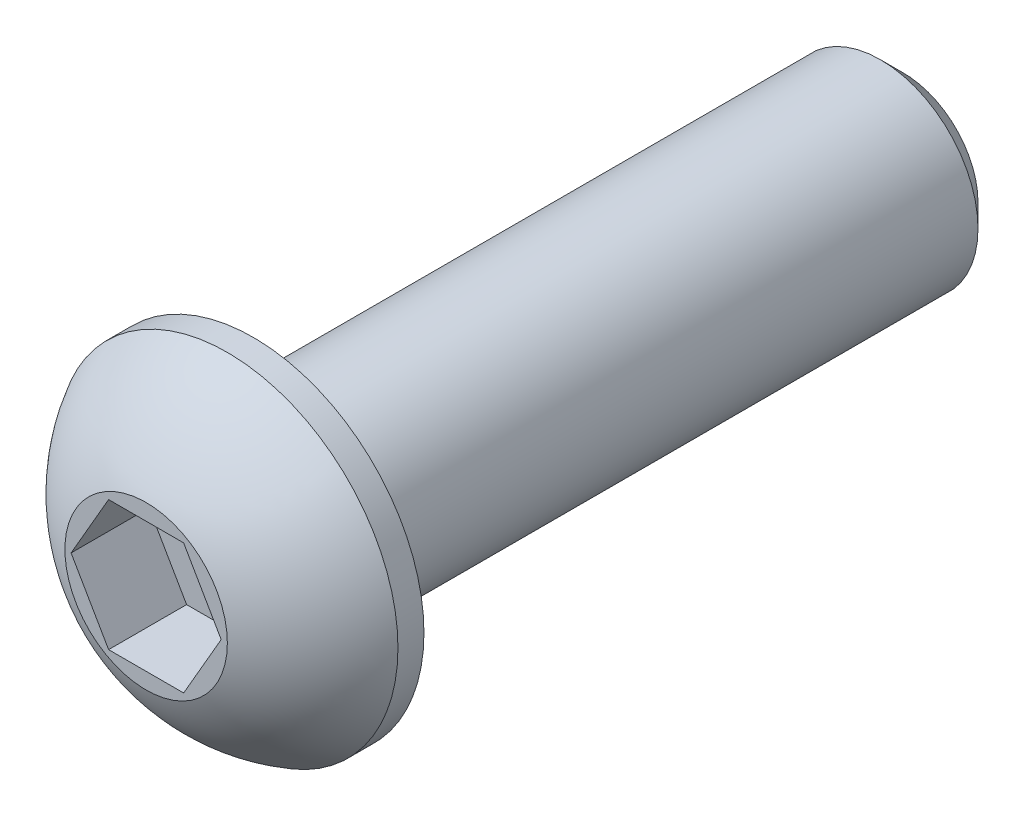
ISO-10303-21;
HEADER;
FILE_DESCRIPTION(('STEP AP214'),'2;1');
FILE_NAME('part.step','',(''),(''),'','','');
FILE_SCHEMA(('AUTOMOTIVE_DESIGN { 1 0 10303 214 1 1 1 1 }'));
ENDSEC;
DATA;
#1=APPLICATION_CONTEXT('core data for automotive mechanical design processes');
#2=APPLICATION_PROTOCOL_DEFINITION('international standard','automotive_design',2000,#1);
#3=PRODUCT_CONTEXT('',#1,'mechanical');
#4=PRODUCT('Part','Part','',(#3));
#5=PRODUCT_RELATED_PRODUCT_CATEGORY('part','',(#4));
#6=PRODUCT_DEFINITION_FORMATION('','',#4);
#7=PRODUCT_DEFINITION_CONTEXT('part definition',#1,'design');
#8=PRODUCT_DEFINITION('design','',#6,#7);
#9=PRODUCT_DEFINITION_SHAPE('','',#8);
#10=(LENGTH_UNIT() NAMED_UNIT(*) SI_UNIT(.MILLI.,.METRE.));
#11=(NAMED_UNIT(*) PLANE_ANGLE_UNIT() SI_UNIT($,.RADIAN.));
#12=(NAMED_UNIT(*) SI_UNIT($,.STERADIAN.) SOLID_ANGLE_UNIT());
#13=UNCERTAINTY_MEASURE_WITH_UNIT(LENGTH_MEASURE(1.E-05),#10,'distance_accuracy_value','');
#14=(GEOMETRIC_REPRESENTATION_CONTEXT(3) GLOBAL_UNCERTAINTY_ASSIGNED_CONTEXT((#13)) GLOBAL_UNIT_ASSIGNED_CONTEXT((#10,
#11,#12)) REPRESENTATION_CONTEXT('',''));
#15=CARTESIAN_POINT('',(0.,0.,0.));
#16=DIRECTION('',(0.,0.,1.));
#17=DIRECTION('',(1.,0.,0.));
#18=AXIS2_PLACEMENT_3D('',#15,#16,#17);
#19=CARTESIAN_POINT('',(0.,0.,0.9));
#20=DIRECTION('',(0.,0.,1.));
#21=DIRECTION('',(1.,0.,0.));
#22=AXIS2_PLACEMENT_3D('',#19,#20,#21);
#23=PLANE('',#22);
#24=DIRECTION('',(0.5,-0.866025403784437,0.));
#25=VECTOR('',#24,1.);
#26=CARTESIAN_POINT('',(-1.15470053837925,-2.,0.9));
#27=LINE('',#26,#25);
#28=CARTESIAN_POINT('',(-2.30940107675851,0.,0.9));
#29=VERTEX_POINT('',#28);
#30=CARTESIAN_POINT('',(-1.15470053837925,-2.,0.9));
#31=VERTEX_POINT('',#30);
#32=EDGE_CURVE('E75',#29,#31,#27,.T.);
#33=ORIENTED_EDGE('',*,*,#32,.T.);
#34=DIRECTION('',(1.,0.,0.));
#35=VECTOR('',#34,1.);
#36=CARTESIAN_POINT('',(1.15470053837924,-2.,0.9));
#37=LINE('',#36,#35);
#38=CARTESIAN_POINT('',(1.15470053837924,-2.,0.9));
#39=VERTEX_POINT('',#38);
#40=EDGE_CURVE('E77',#31,#39,#37,.T.);
#41=ORIENTED_EDGE('',*,*,#40,.T.);
#42=DIRECTION('',(0.5,0.866025403784437,0.));
#43=VECTOR('',#42,1.);
#44=CARTESIAN_POINT('',(2.30940107675851,0.,0.9));
#45=LINE('',#44,#43);
#46=CARTESIAN_POINT('',(2.30940107675851,0.,0.9));
#47=VERTEX_POINT('',#46);
#48=EDGE_CURVE('E62',#39,#47,#45,.T.);
#49=ORIENTED_EDGE('',*,*,#48,.T.);
#50=DIRECTION('',(-0.5,0.86602540378444,0.));
#51=VECTOR('',#50,1.);
#52=CARTESIAN_POINT('',(1.15470053837926,2.,0.9));
#53=LINE('',#52,#51);
#54=CARTESIAN_POINT('',(1.15470053837926,2.,0.9));
#55=VERTEX_POINT('',#54);
#56=EDGE_CURVE('E100',#47,#55,#53,.T.);
#57=ORIENTED_EDGE('',*,*,#56,.T.);
#58=DIRECTION('',(1.,0.,0.));
#59=VECTOR('',#58,1.);
#60=CARTESIAN_POINT('',(-1.15470053837925,2.,0.9));
#61=LINE('',#60,#59);
#62=CARTESIAN_POINT('',(-1.15470053837925,2.,0.9));
#63=VERTEX_POINT('',#62);
#64=EDGE_CURVE('E96',#55,#63,#61,.F.);
#65=ORIENTED_EDGE('',*,*,#64,.T.);
#66=DIRECTION('',(-0.5,-0.866025403784437,0.));
#67=VECTOR('',#66,1.);
#68=CARTESIAN_POINT('',(-2.30940107675851,0.,0.9));
#69=LINE('',#68,#67);
#70=EDGE_CURVE('E79',#63,#29,#69,.T.);
#71=ORIENTED_EDGE('',*,*,#70,.T.);
#72=EDGE_LOOP('',(#33,#41,#49,#57,#65,#71));
#73=FACE_BOUND('',#72,.T.);
#74=ADVANCED_FACE('F16',(#73),#23,.T.);
#75=CARTESIAN_POINT('',(1.15470053837924,-2.,0.9));
#76=DIRECTION('',(0.,-1.,0.));
#77=DIRECTION('',(0.,0.,-1.));
#78=AXIS2_PLACEMENT_3D('',#75,#76,#77);
#79=PLANE('',#78);
#80=DIRECTION('',(0.,0.,1.));
#81=VECTOR('',#80,1.);
#82=CARTESIAN_POINT('',(1.15470053837924,-2.,0.9));
#83=LINE('',#82,#81);
#84=CARTESIAN_POINT('',(1.15470053837924,-2.,3.3));
#85=VERTEX_POINT('',#84);
#86=EDGE_CURVE('E87',#85,#39,#83,.F.);
#87=ORIENTED_EDGE('',*,*,#86,.T.);
#88=ORIENTED_EDGE('',*,*,#40,.F.);
#89=DIRECTION('',(0.,0.,1.));
#90=VECTOR('',#89,1.);
#91=CARTESIAN_POINT('',(-1.15470053837925,-2.,0.9));
#92=LINE('',#91,#90);
#93=CARTESIAN_POINT('',(-1.15470053837925,-2.,3.3));
#94=VERTEX_POINT('',#93);
#95=EDGE_CURVE('E83',#31,#94,#92,.T.);
#96=ORIENTED_EDGE('',*,*,#95,.T.);
#97=DIRECTION('',(1.,0.,0.));
#98=VECTOR('',#97,1.);
#99=CARTESIAN_POINT('',(1.25,-2.,3.3));
#100=LINE('',#99,#98);
#101=EDGE_CURVE('E55',#85,#94,#100,.F.);
#102=ORIENTED_EDGE('',*,*,#101,.F.);
#103=EDGE_LOOP('',(#87,#88,#96,#102));
#104=FACE_BOUND('',#103,.T.);
#105=ADVANCED_FACE('F85',(#104),#79,.F.);
#106=CARTESIAN_POINT('',(-1.15470053837925,-2.,0.9));
#107=DIRECTION('',(-0.866025403784437,-0.5,0.));
#108=DIRECTION('',(0.5,-0.866025403784437,0.));
#109=AXIS2_PLACEMENT_3D('',#106,#107,#108);
#110=PLANE('',#109);
#111=ORIENTED_EDGE('',*,*,#95,.F.);
#112=ORIENTED_EDGE('',*,*,#32,.F.);
#113=DIRECTION('',(0.,0.,1.));
#114=VECTOR('',#113,1.);
#115=CARTESIAN_POINT('',(-2.30940107675851,0.,0.9));
#116=LINE('',#115,#114);
#117=CARTESIAN_POINT('',(-2.30940107675851,0.,3.3));
#118=VERTEX_POINT('',#117);
#119=EDGE_CURVE('E93',#29,#118,#116,.T.);
#120=ORIENTED_EDGE('',*,*,#119,.T.);
#121=DIRECTION('',(-0.5,0.866025403784437,0.));
#122=VECTOR('',#121,1.);
#123=CARTESIAN_POINT('',(-1.15470053837925,-2.,3.3));
#124=LINE('',#123,#122);
#125=EDGE_CURVE('E91',#94,#118,#124,.T.);
#126=ORIENTED_EDGE('',*,*,#125,.F.);
#127=EDGE_LOOP('',(#111,#112,#120,#126));
#128=FACE_BOUND('',#127,.T.);
#129=ADVANCED_FACE('F89',(#128),#110,.F.);
#130=CARTESIAN_POINT('',(-2.30940107675851,0.,0.9));
#131=DIRECTION('',(-0.866025403784437,0.5,0.));
#132=DIRECTION('',(-0.5,-0.866025403784437,0.));
#133=AXIS2_PLACEMENT_3D('',#130,#131,#132);
#134=PLANE('',#133);
#135=ORIENTED_EDGE('',*,*,#119,.F.);
#136=ORIENTED_EDGE('',*,*,#70,.F.);
#137=DIRECTION('',(0.,0.,1.));
#138=VECTOR('',#137,1.);
#139=CARTESIAN_POINT('',(-1.15470053837925,2.,0.9));
#140=LINE('',#139,#138);
#141=CARTESIAN_POINT('',(-1.15470053837925,2.,3.3));
#142=VERTEX_POINT('',#141);
#143=EDGE_CURVE('E98',#63,#142,#140,.T.);
#144=ORIENTED_EDGE('',*,*,#143,.T.);
#145=DIRECTION('',(0.5,0.866025403784437,0.));
#146=VECTOR('',#145,1.);
#147=CARTESIAN_POINT('',(-2.30940107675851,0.,3.3));
#148=LINE('',#147,#146);
#149=EDGE_CURVE('E117',#118,#142,#148,.T.);
#150=ORIENTED_EDGE('',*,*,#149,.F.);
#151=EDGE_LOOP('',(#135,#136,#144,#150));
#152=FACE_BOUND('',#151,.T.);
#153=ADVANCED_FACE('F189',(#152),#134,.F.);
#154=CARTESIAN_POINT('',(-1.15470053837925,2.,0.9));
#155=DIRECTION('',(0.,1.,0.));
#156=DIRECTION('',(0.,0.,1.));
#157=AXIS2_PLACEMENT_3D('',#154,#155,#156);
#158=PLANE('',#157);
#159=ORIENTED_EDGE('',*,*,#143,.F.);
#160=ORIENTED_EDGE('',*,*,#64,.F.);
#161=DIRECTION('',(0.,0.,1.));
#162=VECTOR('',#161,1.);
#163=CARTESIAN_POINT('',(1.15470053837926,2.,0.9));
#164=LINE('',#163,#162);
#165=CARTESIAN_POINT('',(1.15470053837926,2.,3.3));
#166=VERTEX_POINT('',#165);
#167=EDGE_CURVE('E102',#55,#166,#164,.T.);
#168=ORIENTED_EDGE('',*,*,#167,.T.);
#169=DIRECTION('',(1.,0.,0.));
#170=VECTOR('',#169,1.);
#171=CARTESIAN_POINT('',(1.25,2.,3.3));
#172=LINE('',#171,#170);
#173=EDGE_CURVE('E114',#142,#166,#172,.T.);
#174=ORIENTED_EDGE('',*,*,#173,.F.);
#175=EDGE_LOOP('',(#159,#160,#168,#174));
#176=FACE_BOUND('',#175,.T.);
#177=ADVANCED_FACE('F187',(#176),#158,.F.);
#178=CARTESIAN_POINT('',(1.15470053837926,2.,0.9));
#179=DIRECTION('',(0.86602540378444,0.5,0.));
#180=DIRECTION('',(-0.5,0.86602540378444,0.));
#181=AXIS2_PLACEMENT_3D('',#178,#179,#180);
#182=PLANE('',#181);
#183=ORIENTED_EDGE('',*,*,#167,.F.);
#184=ORIENTED_EDGE('',*,*,#56,.F.);
#185=DIRECTION('',(0.,0.,1.));
#186=VECTOR('',#185,1.);
#187=CARTESIAN_POINT('',(2.30940107675851,0.,0.9));
#188=LINE('',#187,#186);
#189=CARTESIAN_POINT('',(2.30940107675851,0.,3.3));
#190=VERTEX_POINT('',#189);
#191=EDGE_CURVE('E35',#47,#190,#188,.T.);
#192=ORIENTED_EDGE('',*,*,#191,.T.);
#193=DIRECTION('',(0.5,-0.86602540378444,0.));
#194=VECTOR('',#193,1.);
#195=CARTESIAN_POINT('',(1.15470053837926,2.,3.3));
#196=LINE('',#195,#194);
#197=EDGE_CURVE('E111',#166,#190,#196,.T.);
#198=ORIENTED_EDGE('',*,*,#197,.F.);
#199=EDGE_LOOP('',(#183,#184,#192,#198));
#200=FACE_BOUND('',#199,.T.);
#201=ADVANCED_FACE('F183',(#200),#182,.F.);
#202=CARTESIAN_POINT('',(2.30940107675851,0.,0.9));
#203=DIRECTION('',(0.866025403784437,-0.5,0.));
#204=DIRECTION('',(0.5,0.866025403784437,0.));
#205=AXIS2_PLACEMENT_3D('',#202,#203,#204);
#206=PLANE('',#205);
#207=ORIENTED_EDGE('',*,*,#191,.F.);
#208=ORIENTED_EDGE('',*,*,#48,.F.);
#209=ORIENTED_EDGE('',*,*,#86,.F.);
#210=DIRECTION('',(-0.5,-0.866025403784437,0.));
#211=VECTOR('',#210,1.);
#212=CARTESIAN_POINT('',(2.30940107675851,0.,3.3));
#213=LINE('',#212,#211);
#214=EDGE_CURVE('E108',#190,#85,#213,.T.);
#215=ORIENTED_EDGE('',*,*,#214,.F.);
#216=EDGE_LOOP('',(#207,#208,#209,#215));
#217=FACE_BOUND('',#216,.T.);
#218=ADVANCED_FACE('F180',(#217),#206,.F.);
#219=CARTESIAN_POINT('',(1.25,0.,3.3));
#220=DIRECTION('',(0.,0.,1.));
#221=DIRECTION('',(1.,0.,0.));
#222=AXIS2_PLACEMENT_3D('',#219,#220,#221);
#223=PLANE('',#222);
#224=CARTESIAN_POINT('',(0.,0.,3.3));
#225=DIRECTION('',(0.,0.,1.));
#226=DIRECTION('',(1.,0.,0.));
#227=AXIS2_PLACEMENT_3D('',#224,#225,#226);
#228=CIRCLE('',#227,2.5);
#229=CARTESIAN_POINT('',(2.5,0.,3.3));
#230=VERTEX_POINT('',#229);
#231=EDGE_CURVE('E20',#230,#230,#228,.F.);
#232=ORIENTED_EDGE('',*,*,#231,.F.);
#233=EDGE_LOOP('',(#232));
#234=FACE_BOUND('',#233,.T.);
#235=ORIENTED_EDGE('',*,*,#197,.T.);
#236=ORIENTED_EDGE('',*,*,#214,.T.);
#237=ORIENTED_EDGE('',*,*,#101,.T.);
#238=ORIENTED_EDGE('',*,*,#125,.T.);
#239=ORIENTED_EDGE('',*,*,#149,.T.);
#240=ORIENTED_EDGE('',*,*,#173,.T.);
#241=EDGE_LOOP('',(#235,#236,#237,#238,#239,#240));
#242=FACE_BOUND('',#241,.T.);
#243=ADVANCED_FACE('F130',(#234,#242),#223,.T.);
#244=CARTESIAN_POINT('',(0.321474250995555,0.,-1.85887832391157));
#245=DIRECTION('',(0.,1.,0.));
#246=DIRECTION('',(1.,0.,0.));
#247=AXIS2_PLACEMENT_3D('',#244,#245,#246);
#248=CIRCLE('',#247,5.6);
#249=TRIMMED_CURVE('',#248,(PARAMETER_VALUE(-1.62823401984114)),
(PARAMETER_VALUE(1.62823401984114)),.T.,.PARAMETER.);
#250=CARTESIAN_POINT('',(0.,0.,-1.85887832391157));
#251=DIRECTION('',(0.,0.,1.));
#252=AXIS1_PLACEMENT('',#250,#251);
#253=SURFACE_OF_REVOLUTION('',#249,#252);
#254=ORIENTED_EDGE('',*,*,#231,.T.);
#255=EDGE_LOOP('',(#254));
#256=FACE_BOUND('',#255,.T.);
#257=CARTESIAN_POINT('',(0.,0.,0.800000000006296));
#258=DIRECTION('',(0.,0.,1.));
#259=DIRECTION('',(1.,0.,0.));
#260=AXIS2_PLACEMENT_3D('',#257,#258,#259);
#261=CIRCLE('',#260,5.25);
#262=CARTESIAN_POINT('',(5.25,0.,0.800000000006296));
#263=VERTEX_POINT('',#262);
#264=EDGE_CURVE('E168',#263,#263,#261,.F.);
#265=ORIENTED_EDGE('',*,*,#264,.F.);
#266=EDGE_LOOP('',(#265));
#267=FACE_BOUND('',#266,.T.);
#268=ADVANCED_FACE('F125',(#256,#267),#253,.F.);
#269=CARTESIAN_POINT('',(0.,0.,3.15491990171557E-12));
#270=DIRECTION('',(0.,0.,1.));
#271=DIRECTION('',(1.,0.,0.));
#272=AXIS2_PLACEMENT_3D('',#269,#270,#271);
#273=CYLINDRICAL_SURFACE('',#272,5.25);
#274=ORIENTED_EDGE('',*,*,#264,.T.);
#275=EDGE_LOOP('',(#274));
#276=FACE_BOUND('',#275,.T.);
#277=CARTESIAN_POINT('',(0.,0.,3.15491990171557E-12));
#278=DIRECTION('',(0.,0.,1.));
#279=DIRECTION('',(1.,0.,0.));
#280=AXIS2_PLACEMENT_3D('',#277,#278,#279);
#281=CIRCLE('',#280,5.25);
#282=CARTESIAN_POINT('',(5.25,0.,3.15491990171557E-12));
#283=VERTEX_POINT('',#282);
#284=EDGE_CURVE('E165',#283,#283,#281,.F.);
#285=ORIENTED_EDGE('',*,*,#284,.F.);
#286=EDGE_LOOP('',(#285));
#287=FACE_BOUND('',#286,.T.);
#288=ADVANCED_FACE('F129',(#276,#287),#273,.T.);
#289=CARTESIAN_POINT('',(4.32524690834502,0.,3.15492076907731E-12));
#290=DIRECTION('',(0.,0.,-1.));
#291=DIRECTION('',(-1.,0.,0.));
#292=AXIS2_PLACEMENT_3D('',#289,#290,#291);
#293=PLANE('',#292);
#294=CARTESIAN_POINT('',(0.,0.,-5.6843418860808E-11));
#295=DIRECTION('',(0.,0.,1.));
#296=DIRECTION('',(1.,0.,0.));
#297=AXIS2_PLACEMENT_3D('',#294,#295,#296);
#298=CIRCLE('',#297,3.40049381671485);
#299=CARTESIAN_POINT('',(3.40049381671485,0.,-5.6843418860808E-11));
#300=VERTEX_POINT('',#299);
#301=EDGE_CURVE('E161',#300,#300,#298,.F.);
#302=ORIENTED_EDGE('',*,*,#301,.F.);
#303=EDGE_LOOP('',(#302));
#304=FACE_BOUND('',#303,.T.);
#305=ORIENTED_EDGE('',*,*,#284,.T.);
#306=EDGE_LOOP('',(#305));
#307=FACE_BOUND('',#306,.T.);
#308=ADVANCED_FACE('F135',(#304,#307),#293,.T.);
#309=CARTESIAN_POINT('',(1.15,0.,-20.));
#310=DIRECTION('',(0.,0.,-1.));
#311=DIRECTION('',(-1.,0.,0.));
#312=AXIS2_PLACEMENT_3D('',#309,#310,#311);
#313=PLANE('',#312);
#314=CARTESIAN_POINT('',(0.,0.,-20.0000000000386));
#315=DIRECTION('',(0.,0.,1.));
#316=DIRECTION('',(1.,0.,0.));
#317=AXIS2_PLACEMENT_3D('',#314,#315,#316);
#318=CIRCLE('',#317,2.29999999999109);
#319=CARTESIAN_POINT('',(2.29999999999109,0.,-20.0000000000386));
#320=VERTEX_POINT('',#319);
#321=EDGE_CURVE('E158',#320,#320,#318,.T.);
#322=ORIENTED_EDGE('',*,*,#321,.F.);
#323=EDGE_LOOP('',(#322));
#324=FACE_BOUND('',#323,.T.);
#325=ADVANCED_FACE('F139',(#324),#313,.T.);
#326=CARTESIAN_POINT('',(0.,0.,-1.13686837721616E-10));
#327=DIRECTION('',(0.,0.,1.));
#328=DIRECTION('',(1.,0.,0.));
#329=AXIS2_PLACEMENT_3D('',#326,#327,#328);
#330=CONICAL_SURFACE('',#329,3.4004938166845,0.490469798602056);
#331=ORIENTED_EDGE('',*,*,#301,.T.);
#332=EDGE_LOOP('',(#331));
#333=FACE_BOUND('',#332,.T.);
#334=CARTESIAN_POINT('',(0.,0.,-0.75));
#335=DIRECTION('',(0.,0.,1.));
#336=DIRECTION('',(1.,0.,0.));
#337=AXIS2_PLACEMENT_3D('',#334,#335,#336);
#338=CIRCLE('',#337,3.);
#339=CARTESIAN_POINT('',(3.,0.,-0.75));
#340=VERTEX_POINT('',#339);
#341=EDGE_CURVE('E26',#340,#340,#338,.F.);
#342=ORIENTED_EDGE('',*,*,#341,.F.);
#343=EDGE_LOOP('',(#342));
#344=FACE_BOUND('',#343,.T.);
#345=ADVANCED_FACE('F143',(#333,#344),#330,.T.);
#346=CARTESIAN_POINT('',(0.,0.,-19.299999999987));
#347=DIRECTION('',(0.,0.,1.));
#348=DIRECTION('',(1.,0.,0.));
#349=AXIS2_PLACEMENT_3D('',#346,#347,#348);
#350=CONICAL_SURFACE('',#349,3.00000000004274,0.785398163397448);
#351=ORIENTED_EDGE('',*,*,#321,.T.);
#352=EDGE_LOOP('',(#351));
#353=FACE_BOUND('',#352,.T.);
#354=CARTESIAN_POINT('',(0.,0.,-19.3));
#355=DIRECTION('',(0.,0.,1.));
#356=DIRECTION('',(1.,0.,0.));
#357=AXIS2_PLACEMENT_3D('',#354,#355,#356);
#358=CIRCLE('',#357,3.);
#359=CARTESIAN_POINT('',(3.,0.,-19.3));
#360=VERTEX_POINT('',#359);
#361=EDGE_CURVE('E11',#360,#360,#358,.T.);
#362=ORIENTED_EDGE('',*,*,#361,.F.);
#363=EDGE_LOOP('',(#362));
#364=FACE_BOUND('',#363,.T.);
#365=ADVANCED_FACE('F146',(#353,#364),#350,.T.);
#366=CARTESIAN_POINT('',(0.,0.,-19.3));
#367=DIRECTION('',(0.,0.,1.));
#368=DIRECTION('',(1.,0.,0.));
#369=AXIS2_PLACEMENT_3D('',#366,#367,#368);
#370=CYLINDRICAL_SURFACE('',#369,3.);
#371=ORIENTED_EDGE('',*,*,#341,.T.);
#372=EDGE_LOOP('',(#371));
#373=FACE_BOUND('',#372,.T.);
#374=ORIENTED_EDGE('',*,*,#361,.T.);
#375=EDGE_LOOP('',(#374));
#376=FACE_BOUND('',#375,.T.);
#377=ADVANCED_FACE('F18',(#373,#376),#370,.T.);
#378=CLOSED_SHELL('',(#74,#105,#129,#153,#177,#201,#218,#243,#268,#288,#308,#325,#345,#365,#377));
#379=MANIFOLD_SOLID_BREP('B1',#378);
#380=ADVANCED_BREP_SHAPE_REPRESENTATION('',(#18,#379),#14);
#381=SHAPE_DEFINITION_REPRESENTATION(#9,#380);
ENDSEC;
END-ISO-10303-21;
